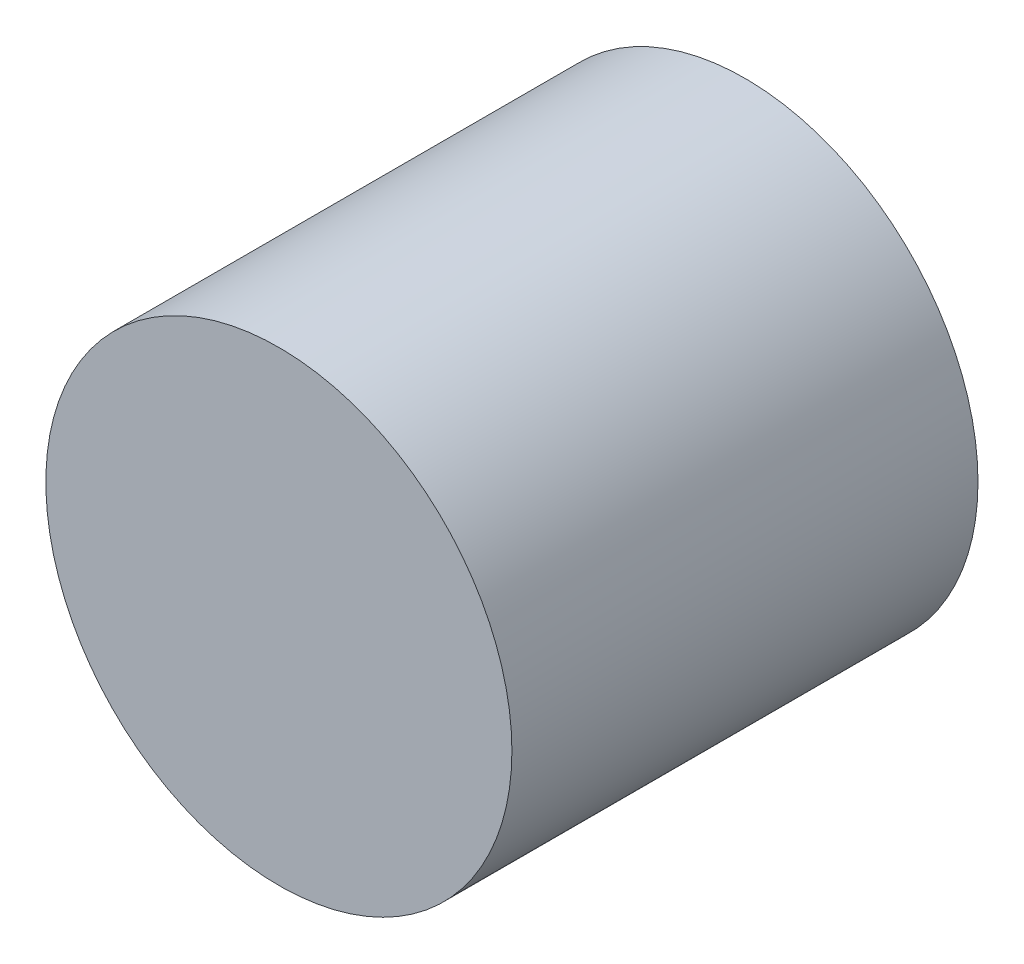
ISO-10303-21;
HEADER;
FILE_DESCRIPTION(('STEP AP214'),'2;1');
FILE_NAME('part.step','',(''),(''),'','','');
FILE_SCHEMA(('AUTOMOTIVE_DESIGN { 1 0 10303 214 1 1 1 1 }'));
ENDSEC;
DATA;
#1=APPLICATION_CONTEXT('core data for automotive mechanical design processes');
#2=APPLICATION_PROTOCOL_DEFINITION('international standard','automotive_design',2000,#1);
#3=PRODUCT_CONTEXT('',#1,'mechanical');
#4=PRODUCT('Part','Part','',(#3));
#5=PRODUCT_RELATED_PRODUCT_CATEGORY('part','',(#4));
#6=PRODUCT_DEFINITION_FORMATION('','',#4);
#7=PRODUCT_DEFINITION_CONTEXT('part definition',#1,'design');
#8=PRODUCT_DEFINITION('design','',#6,#7);
#9=PRODUCT_DEFINITION_SHAPE('','',#8);
#10=(LENGTH_UNIT() NAMED_UNIT(*) SI_UNIT(.MILLI.,.METRE.));
#11=(NAMED_UNIT(*) PLANE_ANGLE_UNIT() SI_UNIT($,.RADIAN.));
#12=(NAMED_UNIT(*) SI_UNIT($,.STERADIAN.) SOLID_ANGLE_UNIT());
#13=UNCERTAINTY_MEASURE_WITH_UNIT(LENGTH_MEASURE(1.E-05),#10,'distance_accuracy_value','');
#14=(GEOMETRIC_REPRESENTATION_CONTEXT(3) GLOBAL_UNCERTAINTY_ASSIGNED_CONTEXT((#13)) GLOBAL_UNIT_ASSIGNED_CONTEXT((#10,
#11,#12)) REPRESENTATION_CONTEXT('',''));
#15=CARTESIAN_POINT('',(0.,0.,0.));
#16=DIRECTION('',(0.,0.,1.));
#17=DIRECTION('',(1.,0.,0.));
#18=AXIS2_PLACEMENT_3D('',#15,#16,#17);
#19=CARTESIAN_POINT('',(0.,0.,20.));
#20=DIRECTION('',(0.,0.,-1.));
#21=DIRECTION('',(-1.,0.,0.));
#22=AXIS2_PLACEMENT_3D('',#19,#20,#21);
#23=CYLINDRICAL_SURFACE('',#22,10.);
#24=CARTESIAN_POINT('',(0.,0.,20.));
#25=DIRECTION('',(0.,0.,1.));
#26=DIRECTION('',(1.,0.,0.));
#27=AXIS2_PLACEMENT_3D('',#24,#25,#26);
#28=CIRCLE('',#27,10.);
#29=CARTESIAN_POINT('',(10.,0.,20.));
#30=VERTEX_POINT('',#29);
#31=EDGE_CURVE('E11',#30,#30,#28,.T.);
#32=ORIENTED_EDGE('',*,*,#31,.F.);
#33=EDGE_LOOP('',(#32));
#34=FACE_BOUND('',#33,.T.);
#35=CARTESIAN_POINT('',(0.,0.,0.));
#36=DIRECTION('',(0.,0.,1.));
#37=DIRECTION('',(1.,0.,0.));
#38=AXIS2_PLACEMENT_3D('',#35,#36,#37);
#39=CIRCLE('',#38,10.);
#40=CARTESIAN_POINT('',(10.,0.,0.));
#41=VERTEX_POINT('',#40);
#42=EDGE_CURVE('E48',#41,#41,#39,.T.);
#43=ORIENTED_EDGE('',*,*,#42,.T.);
#44=EDGE_LOOP('',(#43));
#45=FACE_BOUND('',#44,.T.);
#46=ADVANCED_FACE('F45',(#34,#45),#23,.T.);
#47=CARTESIAN_POINT('',(0.,0.,20.));
#48=DIRECTION('',(0.,0.,1.));
#49=DIRECTION('',(1.,0.,0.));
#50=AXIS2_PLACEMENT_3D('',#47,#48,#49);
#51=PLANE('',#50);
#52=ORIENTED_EDGE('',*,*,#31,.T.);
#53=EDGE_LOOP('',(#52));
#54=FACE_BOUND('',#53,.T.);
#55=ADVANCED_FACE('F83',(#54),#51,.T.);
#56=CARTESIAN_POINT('',(0.,0.,0.));
#57=DIRECTION('',(0.,0.,1.));
#58=DIRECTION('',(1.,0.,0.));
#59=AXIS2_PLACEMENT_3D('',#56,#57,#58);
#60=PLANE('',#59);
#61=CARTESIAN_POINT('',(0.,0.,0.));
#62=DIRECTION('',(0.,0.,-1.));
#63=DIRECTION('',(-1.,0.,0.));
#64=AXIS2_PLACEMENT_3D('',#61,#62,#63);
#65=CIRCLE('',#64,1.275);
#66=CARTESIAN_POINT('',(-1.275,0.,0.));
#67=VERTEX_POINT('',#66);
#68=EDGE_CURVE('E72',#67,#67,#65,.T.);
#69=ORIENTED_EDGE('',*,*,#68,.F.);
#70=EDGE_LOOP('',(#69));
#71=FACE_BOUND('',#70,.T.);
#72=ORIENTED_EDGE('',*,*,#42,.F.);
#73=EDGE_LOOP('',(#72));
#74=FACE_BOUND('',#73,.T.);
#75=ADVANCED_FACE('F59',(#71,#74),#60,.F.);
#76=CARTESIAN_POINT('',(0.,0.,9.99999999999999));
#77=DIRECTION('',(0.,0.,-1.));
#78=DIRECTION('',(-1.,0.,0.));
#79=AXIS2_PLACEMENT_3D('',#76,#77,#78);
#80=CONICAL_SURFACE('',#79,1.24999999999999,1.02974425867665);
#81=CARTESIAN_POINT('',(0.,0.,10.7510757737844));
#82=VERTEX_POINT('',#81);
#83=VERTEX_LOOP('',#82);
#84=FACE_BOUND('',#83,.T.);
#85=CARTESIAN_POINT('',(0.,0.,9.99999999999999));
#86=DIRECTION('',(0.,0.,-1.));
#87=DIRECTION('',(-1.,0.,0.));
#88=AXIS2_PLACEMENT_3D('',#85,#86,#87);
#89=CIRCLE('',#88,1.24999999999999);
#90=CARTESIAN_POINT('',(-1.24999999999999,0.,9.99999999999999));
#91=VERTEX_POINT('',#90);
#92=EDGE_CURVE('E63',#91,#91,#89,.T.);
#93=ORIENTED_EDGE('',*,*,#92,.T.);
#94=EDGE_LOOP('',(#93));
#95=FACE_BOUND('',#94,.T.);
#96=ADVANCED_FACE('F55',(#84,#95),#80,.F.);
#97=CARTESIAN_POINT('',(0.,0.,0.));
#98=DIRECTION('',(0.,0.,-1.));
#99=DIRECTION('',(-1.,0.,0.));
#100=AXIS2_PLACEMENT_3D('',#97,#98,#99);
#101=CYLINDRICAL_SURFACE('',#100,1.24999999999999);
#102=ORIENTED_EDGE('',*,*,#92,.F.);
#103=EDGE_LOOP('',(#102));
#104=FACE_BOUND('',#103,.T.);
#105=CARTESIAN_POINT('',(0.,0.,0.0250000000000111));
#106=DIRECTION('',(0.,0.,-1.));
#107=DIRECTION('',(-1.,0.,0.));
#108=AXIS2_PLACEMENT_3D('',#105,#106,#107);
#109=CIRCLE('',#108,1.24999999999999);
#110=CARTESIAN_POINT('',(-1.24999999999999,0.,0.0250000000000111));
#111=VERTEX_POINT('',#110);
#112=EDGE_CURVE('E66',#111,#111,#109,.T.);
#113=ORIENTED_EDGE('',*,*,#112,.T.);
#114=EDGE_LOOP('',(#113));
#115=FACE_BOUND('',#114,.T.);
#116=ADVANCED_FACE('F58',(#104,#115),#101,.F.);
#117=CARTESIAN_POINT('',(0.,0.,0.));
#118=DIRECTION('',(0.,0.,-1.));
#119=DIRECTION('',(-1.,0.,0.));
#120=AXIS2_PLACEMENT_3D('',#117,#118,#119);
#121=CONICAL_SURFACE('',#120,1.275,0.785398163397461);
#122=ORIENTED_EDGE('',*,*,#112,.F.);
#123=EDGE_LOOP('',(#122));
#124=FACE_BOUND('',#123,.T.);
#125=ORIENTED_EDGE('',*,*,#68,.T.);
#126=EDGE_LOOP('',(#125));
#127=FACE_BOUND('',#126,.T.);
#128=ADVANCED_FACE('F79',(#124,#127),#121,.F.);
#129=CLOSED_SHELL('',(#46,#55,#75,#96,#116,#128));
#130=MANIFOLD_SOLID_BREP('B2',#129);
#131=ADVANCED_BREP_SHAPE_REPRESENTATION('',(#18,#130),#14);
#132=SHAPE_DEFINITION_REPRESENTATION(#9,#131);
ENDSEC;
END-ISO-10303-21;
